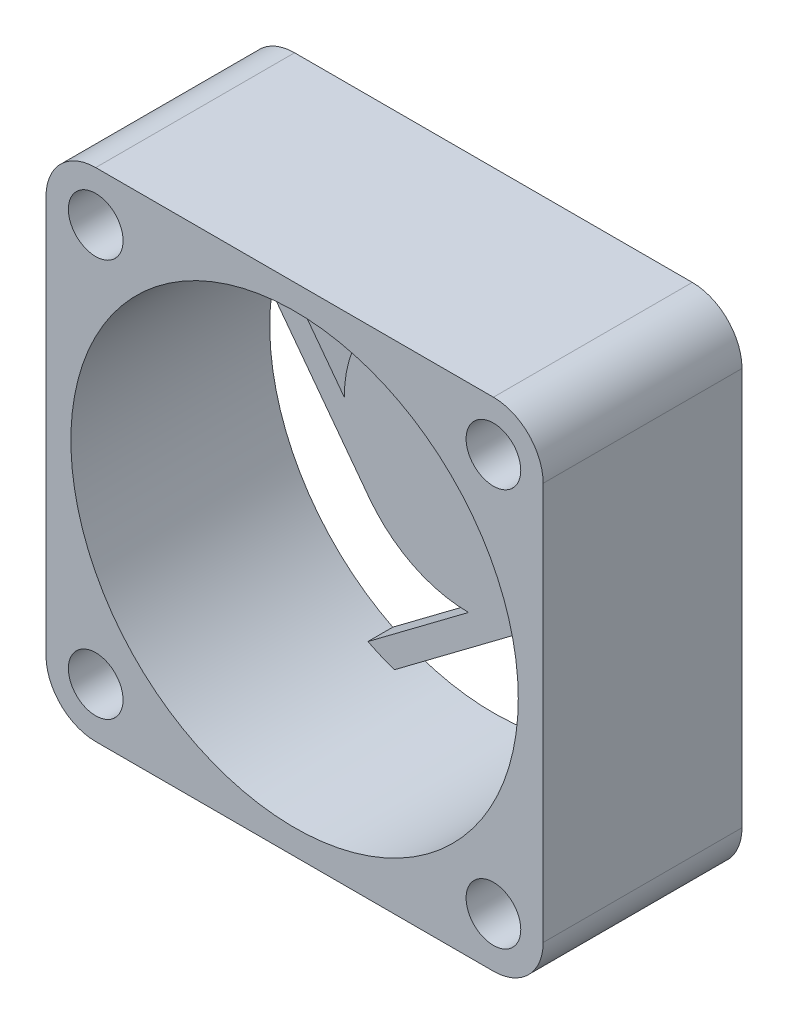
ISO-10303-21;
HEADER;
FILE_DESCRIPTION(('STEP AP214'),'2;1');
FILE_NAME('part.step','',(''),(''),'','','');
FILE_SCHEMA(('AUTOMOTIVE_DESIGN { 1 0 10303 214 1 1 1 1 }'));
ENDSEC;
DATA;
#1=APPLICATION_CONTEXT('core data for automotive mechanical design processes');
#2=APPLICATION_PROTOCOL_DEFINITION('international standard','automotive_design',2000,#1);
#3=PRODUCT_CONTEXT('',#1,'mechanical');
#4=PRODUCT('Part','Part','',(#3));
#5=PRODUCT_RELATED_PRODUCT_CATEGORY('part','',(#4));
#6=PRODUCT_DEFINITION_FORMATION('','',#4);
#7=PRODUCT_DEFINITION_CONTEXT('part definition',#1,'design');
#8=PRODUCT_DEFINITION('design','',#6,#7);
#9=PRODUCT_DEFINITION_SHAPE('','',#8);
#10=(LENGTH_UNIT() NAMED_UNIT(*) SI_UNIT(.MILLI.,.METRE.));
#11=(NAMED_UNIT(*) PLANE_ANGLE_UNIT() SI_UNIT($,.RADIAN.));
#12=(NAMED_UNIT(*) SI_UNIT($,.STERADIAN.) SOLID_ANGLE_UNIT());
#13=UNCERTAINTY_MEASURE_WITH_UNIT(LENGTH_MEASURE(1.E-05),#10,'distance_accuracy_value','');
#14=(GEOMETRIC_REPRESENTATION_CONTEXT(3) GLOBAL_UNCERTAINTY_ASSIGNED_CONTEXT((#13)) GLOBAL_UNIT_ASSIGNED_CONTEXT((#10,
#11,#12)) REPRESENTATION_CONTEXT('',''));
#15=CARTESIAN_POINT('',(0.,0.,0.));
#16=DIRECTION('',(0.,0.,1.));
#17=DIRECTION('',(1.,0.,0.));
#18=AXIS2_PLACEMENT_3D('',#15,#16,#17);
#19=CARTESIAN_POINT('',(0.,0.,8.));
#20=DIRECTION('',(0.,0.,-1.));
#21=DIRECTION('',(-1.,0.,0.));
#22=AXIS2_PLACEMENT_3D('',#19,#20,#21);
#23=PLANE('',#22);
#24=CARTESIAN_POINT('',(0.,0.,8.));
#25=DIRECTION('',(0.,0.,1.));
#26=DIRECTION('',(1.,0.,0.));
#27=AXIS2_PLACEMENT_3D('',#24,#25,#26);
#28=CIRCLE('',#27,9.);
#29=CARTESIAN_POINT('',(9.,0.,8.));
#30=VERTEX_POINT('',#29);
#31=EDGE_CURVE('E324',#30,#30,#28,.T.);
#32=ORIENTED_EDGE('',*,*,#31,.F.);
#33=EDGE_LOOP('',(#32));
#34=FACE_BOUND('',#33,.T.);
#35=DIRECTION('',(1.,0.,0.));
#36=VECTOR('',#35,1.);
#37=CARTESIAN_POINT('',(-10.,-10.,8.));
#38=LINE('',#37,#36);
#39=CARTESIAN_POINT('',(-8.,-10.,8.));
#40=VERTEX_POINT('',#39);
#41=CARTESIAN_POINT('',(8.00000000000001,-10.,8.));
#42=VERTEX_POINT('',#41);
#43=EDGE_CURVE('E364',#40,#42,#38,.T.);
#44=ORIENTED_EDGE('',*,*,#43,.T.);
#45=CARTESIAN_POINT('',(8.,-8.,8.));
#46=DIRECTION('',(0.,0.,-1.));
#47=DIRECTION('',(-1.,0.,0.));
#48=AXIS2_PLACEMENT_3D('',#45,#46,#47);
#49=CIRCLE('',#48,2.);
#50=CARTESIAN_POINT('',(10.,-8.,8.));
#51=VERTEX_POINT('',#50);
#52=EDGE_CURVE('E399',#42,#51,#49,.F.);
#53=ORIENTED_EDGE('',*,*,#52,.T.);
#54=DIRECTION('',(0.,1.,0.));
#55=VECTOR('',#54,1.);
#56=CARTESIAN_POINT('',(10.,-10.,8.));
#57=LINE('',#56,#55);
#58=CARTESIAN_POINT('',(10.,8.,8.));
#59=VERTEX_POINT('',#58);
#60=EDGE_CURVE('E356',#51,#59,#57,.T.);
#61=ORIENTED_EDGE('',*,*,#60,.T.);
#62=CARTESIAN_POINT('',(8.00000000000001,8.,8.));
#63=DIRECTION('',(0.,0.,-1.));
#64=DIRECTION('',(-1.,0.,0.));
#65=AXIS2_PLACEMENT_3D('',#62,#63,#64);
#66=CIRCLE('',#65,2.);
#67=CARTESIAN_POINT('',(8.00000000000001,10.,8.));
#68=VERTEX_POINT('',#67);
#69=EDGE_CURVE('E394',#59,#68,#66,.F.);
#70=ORIENTED_EDGE('',*,*,#69,.T.);
#71=DIRECTION('',(-1.,0.,0.));
#72=VECTOR('',#71,1.);
#73=CARTESIAN_POINT('',(-10.,10.,8.));
#74=LINE('',#73,#72);
#75=CARTESIAN_POINT('',(-8.,10.,8.));
#76=VERTEX_POINT('',#75);
#77=EDGE_CURVE('E359',#68,#76,#74,.T.);
#78=ORIENTED_EDGE('',*,*,#77,.T.);
#79=CARTESIAN_POINT('',(-8.,8.,8.));
#80=DIRECTION('',(0.,0.,-1.));
#81=DIRECTION('',(-1.,0.,0.));
#82=AXIS2_PLACEMENT_3D('',#79,#80,#81);
#83=CIRCLE('',#82,2.);
#84=CARTESIAN_POINT('',(-10.,8.,8.));
#85=VERTEX_POINT('',#84);
#86=EDGE_CURVE('E60',#76,#85,#83,.F.);
#87=ORIENTED_EDGE('',*,*,#86,.T.);
#88=DIRECTION('',(0.,-1.,0.));
#89=VECTOR('',#88,1.);
#90=CARTESIAN_POINT('',(-10.,-10.,8.));
#91=LINE('',#90,#89);
#92=CARTESIAN_POINT('',(-10.,-8.,8.));
#93=VERTEX_POINT('',#92);
#94=EDGE_CURVE('E362',#85,#93,#91,.T.);
#95=ORIENTED_EDGE('',*,*,#94,.T.);
#96=CARTESIAN_POINT('',(-8.,-8.,8.));
#97=DIRECTION('',(0.,0.,-1.));
#98=DIRECTION('',(-1.,0.,0.));
#99=AXIS2_PLACEMENT_3D('',#96,#97,#98);
#100=CIRCLE('',#99,2.);
#101=EDGE_CURVE('E397',#93,#40,#100,.F.);
#102=ORIENTED_EDGE('',*,*,#101,.T.);
#103=EDGE_LOOP('',(#44,#53,#61,#70,#78,#87,#95,#102));
#104=FACE_BOUND('',#103,.T.);
#105=CARTESIAN_POINT('',(-8.,8.,8.));
#106=DIRECTION('',(0.,0.,1.));
#107=DIRECTION('',(1.,0.,0.));
#108=AXIS2_PLACEMENT_3D('',#105,#106,#107);
#109=CIRCLE('',#108,1.1);
#110=CARTESIAN_POINT('',(-6.9,8.,8.));
#111=VERTEX_POINT('',#110);
#112=EDGE_CURVE('E350',#111,#111,#109,.T.);
#113=ORIENTED_EDGE('',*,*,#112,.F.);
#114=EDGE_LOOP('',(#113));
#115=FACE_BOUND('',#114,.T.);
#116=CARTESIAN_POINT('',(-8.,-8.,8.));
#117=DIRECTION('',(0.,0.,1.));
#118=DIRECTION('',(1.,0.,0.));
#119=AXIS2_PLACEMENT_3D('',#116,#117,#118);
#120=CIRCLE('',#119,1.1);
#121=CARTESIAN_POINT('',(-6.9,-8.,8.));
#122=VERTEX_POINT('',#121);
#123=EDGE_CURVE('E344',#122,#122,#120,.T.);
#124=ORIENTED_EDGE('',*,*,#123,.F.);
#125=EDGE_LOOP('',(#124));
#126=FACE_BOUND('',#125,.T.);
#127=CARTESIAN_POINT('',(8.00000000000001,-8.,8.));
#128=DIRECTION('',(0.,0.,1.));
#129=DIRECTION('',(1.,0.,0.));
#130=AXIS2_PLACEMENT_3D('',#127,#128,#129);
#131=CIRCLE('',#130,1.1);
#132=CARTESIAN_POINT('',(9.1,-8.,8.));
#133=VERTEX_POINT('',#132);
#134=EDGE_CURVE('E338',#133,#133,#131,.T.);
#135=ORIENTED_EDGE('',*,*,#134,.F.);
#136=EDGE_LOOP('',(#135));
#137=FACE_BOUND('',#136,.T.);
#138=CARTESIAN_POINT('',(8.,8.,8.));
#139=DIRECTION('',(0.,0.,1.));
#140=DIRECTION('',(1.,0.,0.));
#141=AXIS2_PLACEMENT_3D('',#138,#139,#140);
#142=CIRCLE('',#141,1.1);
#143=CARTESIAN_POINT('',(9.10000000000001,8.,8.));
#144=VERTEX_POINT('',#143);
#145=EDGE_CURVE('E332',#144,#144,#142,.T.);
#146=ORIENTED_EDGE('',*,*,#145,.F.);
#147=EDGE_LOOP('',(#146));
#148=FACE_BOUND('',#147,.T.);
#149=ADVANCED_FACE('F38',(#34,#104,#115,#126,#137,#148),#23,.F.);
#150=CARTESIAN_POINT('',(0.,0.,0.));
#151=DIRECTION('',(0.,0.,-1.));
#152=DIRECTION('',(-1.,0.,0.));
#153=AXIS2_PLACEMENT_3D('',#150,#151,#152);
#154=PLANE('',#153);
#155=CARTESIAN_POINT('',(0.,0.,0.));
#156=DIRECTION('',(0.,0.,-1.));
#157=DIRECTION('',(-1.,0.,0.));
#158=AXIS2_PLACEMENT_3D('',#155,#156,#157);
#159=CIRCLE('',#158,5.);
#160=CARTESIAN_POINT('',(-5.,0.,0.));
#161=VERTEX_POINT('',#160);
#162=CARTESIAN_POINT('',(-3.,4.,0.));
#163=VERTEX_POINT('',#162);
#164=EDGE_CURVE('E257',#161,#163,#159,.T.);
#165=ORIENTED_EDGE('',*,*,#164,.T.);
#166=DIRECTION('',(0.8,0.6,0.));
#167=VECTOR('',#166,1.);
#168=CARTESIAN_POINT('',(-3.,4.,0.));
#169=LINE('',#168,#167);
#170=CARTESIAN_POINT('',(2.98665181883831,8.48998886412873,0.));
#171=VERTEX_POINT('',#170);
#172=EDGE_CURVE('E237',#163,#171,#169,.T.);
#173=ORIENTED_EDGE('',*,*,#172,.T.);
#174=CARTESIAN_POINT('',(0.,0.,0.));
#175=DIRECTION('',(0.,0.,-1.));
#176=DIRECTION('',(-1.,0.,0.));
#177=AXIS2_PLACEMENT_3D('',#174,#175,#176);
#178=CIRCLE('',#177,9.);
#179=CARTESIAN_POINT('',(-8.03735464897913,4.04980619863884,0.));
#180=VERTEX_POINT('',#179);
#181=EDGE_CURVE('E263',#171,#180,#178,.F.);
#182=ORIENTED_EDGE('',*,*,#181,.T.);
#183=DIRECTION('',(0.6,-0.8,0.));
#184=VECTOR('',#183,1.);
#185=CARTESIAN_POINT('',(-5.,0.,0.));
#186=LINE('',#185,#184);
#187=EDGE_CURVE('E260',#180,#161,#186,.T.);
#188=ORIENTED_EDGE('',*,*,#187,.T.);
#189=EDGE_LOOP('',(#165,#173,#182,#188));
#190=FACE_BOUND('',#189,.T.);
#191=CARTESIAN_POINT('',(0.,0.,0.));
#192=DIRECTION('',(0.,0.,-1.));
#193=DIRECTION('',(-1.,0.,0.));
#194=AXIS2_PLACEMENT_3D('',#191,#192,#193);
#195=CIRCLE('',#194,5.);
#196=CARTESIAN_POINT('',(0.,-5.,0.));
#197=VERTEX_POINT('',#196);
#198=CARTESIAN_POINT('',(-4.,-3.,0.));
#199=VERTEX_POINT('',#198);
#200=EDGE_CURVE('E286',#197,#199,#195,.T.);
#201=ORIENTED_EDGE('',*,*,#200,.T.);
#202=DIRECTION('',(-0.6,0.8,0.));
#203=VECTOR('',#202,1.);
#204=CARTESIAN_POINT('',(-4.,-3.,0.));
#205=LINE('',#204,#203);
#206=CARTESIAN_POINT('',(-8.48998886412873,2.98665181883831,0.));
#207=VERTEX_POINT('',#206);
#208=EDGE_CURVE('E266',#199,#207,#205,.T.);
#209=ORIENTED_EDGE('',*,*,#208,.T.);
#210=CARTESIAN_POINT('',(0.,0.,0.));
#211=DIRECTION('',(0.,0.,-1.));
#212=DIRECTION('',(-1.,0.,0.));
#213=AXIS2_PLACEMENT_3D('',#210,#211,#212);
#214=CIRCLE('',#213,9.);
#215=CARTESIAN_POINT('',(-4.04980619863884,-8.03735464897913,0.));
#216=VERTEX_POINT('',#215);
#217=EDGE_CURVE('E292',#207,#216,#214,.F.);
#218=ORIENTED_EDGE('',*,*,#217,.T.);
#219=DIRECTION('',(0.8,0.6,0.));
#220=VECTOR('',#219,1.);
#221=CARTESIAN_POINT('',(0.,-5.,0.));
#222=LINE('',#221,#220);
#223=EDGE_CURVE('E289',#216,#197,#222,.T.);
#224=ORIENTED_EDGE('',*,*,#223,.T.);
#225=EDGE_LOOP('',(#201,#209,#218,#224));
#226=FACE_BOUND('',#225,.T.);
#227=CARTESIAN_POINT('',(0.,0.,0.));
#228=DIRECTION('',(0.,0.,-1.));
#229=DIRECTION('',(-1.,0.,0.));
#230=AXIS2_PLACEMENT_3D('',#227,#228,#229);
#231=CIRCLE('',#230,5.);
#232=CARTESIAN_POINT('',(0.,5.,0.));
#233=VERTEX_POINT('',#232);
#234=CARTESIAN_POINT('',(4.,3.,0.));
#235=VERTEX_POINT('',#234);
#236=EDGE_CURVE('E208',#233,#235,#231,.T.);
#237=ORIENTED_EDGE('',*,*,#236,.T.);
#238=DIRECTION('',(0.6,-0.8,0.));
#239=VECTOR('',#238,1.);
#240=CARTESIAN_POINT('',(4.,3.,0.));
#241=LINE('',#240,#239);
#242=CARTESIAN_POINT('',(8.48998886412873,-2.98665181883831,0.));
#243=VERTEX_POINT('',#242);
#244=EDGE_CURVE('E212',#235,#243,#241,.T.);
#245=ORIENTED_EDGE('',*,*,#244,.T.);
#246=CARTESIAN_POINT('',(0.,0.,0.));
#247=DIRECTION('',(0.,0.,-1.));
#248=DIRECTION('',(-1.,0.,0.));
#249=AXIS2_PLACEMENT_3D('',#246,#247,#248);
#250=CIRCLE('',#249,9.);
#251=CARTESIAN_POINT('',(4.04980619863884,8.03735464897913,0.));
#252=VERTEX_POINT('',#251);
#253=EDGE_CURVE('E234',#243,#252,#250,.F.);
#254=ORIENTED_EDGE('',*,*,#253,.T.);
#255=DIRECTION('',(-0.8,-0.6,0.));
#256=VECTOR('',#255,1.);
#257=CARTESIAN_POINT('',(0.,5.,0.));
#258=LINE('',#257,#256);
#259=EDGE_CURVE('E229',#252,#233,#258,.T.);
#260=ORIENTED_EDGE('',*,*,#259,.T.);
#261=EDGE_LOOP('',(#237,#245,#254,#260));
#262=FACE_BOUND('',#261,.T.);
#263=CARTESIAN_POINT('',(0.,0.,0.));
#264=DIRECTION('',(0.,0.,-1.));
#265=DIRECTION('',(-1.,0.,0.));
#266=AXIS2_PLACEMENT_3D('',#263,#264,#265);
#267=CIRCLE('',#266,5.);
#268=CARTESIAN_POINT('',(5.,0.,0.));
#269=VERTEX_POINT('',#268);
#270=CARTESIAN_POINT('',(3.,-4.,0.));
#271=VERTEX_POINT('',#270);
#272=EDGE_CURVE('E301',#269,#271,#267,.T.);
#273=ORIENTED_EDGE('',*,*,#272,.T.);
#274=DIRECTION('',(-0.8,-0.6,0.));
#275=VECTOR('',#274,1.);
#276=CARTESIAN_POINT('',(3.,-4.,0.));
#277=LINE('',#276,#275);
#278=CARTESIAN_POINT('',(-2.98665181883831,-8.48998886412873,0.));
#279=VERTEX_POINT('',#278);
#280=EDGE_CURVE('E316',#271,#279,#277,.T.);
#281=ORIENTED_EDGE('',*,*,#280,.T.);
#282=CARTESIAN_POINT('',(0.,0.,0.));
#283=DIRECTION('',(0.,0.,-1.));
#284=DIRECTION('',(-1.,0.,0.));
#285=AXIS2_PLACEMENT_3D('',#282,#283,#284);
#286=CIRCLE('',#285,9.);
#287=CARTESIAN_POINT('',(8.03735464897913,-4.04980619863884,0.));
#288=VERTEX_POINT('',#287);
#289=EDGE_CURVE('E295',#279,#288,#286,.F.);
#290=ORIENTED_EDGE('',*,*,#289,.T.);
#291=DIRECTION('',(-0.6,0.8,0.));
#292=VECTOR('',#291,1.);
#293=CARTESIAN_POINT('',(5.,0.,0.));
#294=LINE('',#293,#292);
#295=EDGE_CURVE('E298',#288,#269,#294,.T.);
#296=ORIENTED_EDGE('',*,*,#295,.T.);
#297=EDGE_LOOP('',(#273,#281,#290,#296));
#298=FACE_BOUND('',#297,.T.);
#299=CARTESIAN_POINT('',(8.00000000000001,-8.,0.));
#300=DIRECTION('',(0.,0.,1.));
#301=DIRECTION('',(1.,0.,0.));
#302=AXIS2_PLACEMENT_3D('',#299,#300,#301);
#303=CIRCLE('',#302,1.1);
#304=CARTESIAN_POINT('',(9.1,-8.,0.));
#305=VERTEX_POINT('',#304);
#306=EDGE_CURVE('E335',#305,#305,#303,.T.);
#307=ORIENTED_EDGE('',*,*,#306,.T.);
#308=EDGE_LOOP('',(#307));
#309=FACE_BOUND('',#308,.T.);
#310=CARTESIAN_POINT('',(-8.,8.,0.));
#311=DIRECTION('',(0.,0.,1.));
#312=DIRECTION('',(1.,0.,0.));
#313=AXIS2_PLACEMENT_3D('',#310,#311,#312);
#314=CIRCLE('',#313,1.1);
#315=CARTESIAN_POINT('',(-6.9,8.,0.));
#316=VERTEX_POINT('',#315);
#317=EDGE_CURVE('E347',#316,#316,#314,.T.);
#318=ORIENTED_EDGE('',*,*,#317,.T.);
#319=EDGE_LOOP('',(#318));
#320=FACE_BOUND('',#319,.T.);
#321=DIRECTION('',(0.,1.,0.));
#322=VECTOR('',#321,1.);
#323=CARTESIAN_POINT('',(10.,-10.,0.));
#324=LINE('',#323,#322);
#325=CARTESIAN_POINT('',(10.,-8.,0.));
#326=VERTEX_POINT('',#325);
#327=CARTESIAN_POINT('',(10.,8.,0.));
#328=VERTEX_POINT('',#327);
#329=EDGE_CURVE('E353',#326,#328,#324,.T.);
#330=ORIENTED_EDGE('',*,*,#329,.F.);
#331=CARTESIAN_POINT('',(8.,-8.,0.));
#332=DIRECTION('',(0.,0.,-1.));
#333=DIRECTION('',(-1.,0.,0.));
#334=AXIS2_PLACEMENT_3D('',#331,#332,#333);
#335=CIRCLE('',#334,2.);
#336=CARTESIAN_POINT('',(8.00000000000001,-10.,0.));
#337=VERTEX_POINT('',#336);
#338=EDGE_CURVE('E387',#326,#337,#335,.T.);
#339=ORIENTED_EDGE('',*,*,#338,.T.);
#340=DIRECTION('',(1.,0.,0.));
#341=VECTOR('',#340,1.);
#342=CARTESIAN_POINT('',(-10.,-10.,0.));
#343=LINE('',#342,#341);
#344=CARTESIAN_POINT('',(-8.,-10.,0.));
#345=VERTEX_POINT('',#344);
#346=EDGE_CURVE('E360',#345,#337,#343,.T.);
#347=ORIENTED_EDGE('',*,*,#346,.F.);
#348=CARTESIAN_POINT('',(-8.,-8.,0.));
#349=DIRECTION('',(0.,0.,-1.));
#350=DIRECTION('',(-1.,0.,0.));
#351=AXIS2_PLACEMENT_3D('',#348,#349,#350);
#352=CIRCLE('',#351,2.);
#353=CARTESIAN_POINT('',(-10.,-8.,0.));
#354=VERTEX_POINT('',#353);
#355=EDGE_CURVE('E385',#345,#354,#352,.T.);
#356=ORIENTED_EDGE('',*,*,#355,.T.);
#357=DIRECTION('',(0.,-1.,0.));
#358=VECTOR('',#357,1.);
#359=CARTESIAN_POINT('',(-10.,-10.,0.));
#360=LINE('',#359,#358);
#361=CARTESIAN_POINT('',(-10.,8.,0.));
#362=VERTEX_POINT('',#361);
#363=EDGE_CURVE('E373',#362,#354,#360,.T.);
#364=ORIENTED_EDGE('',*,*,#363,.F.);
#365=CARTESIAN_POINT('',(-8.,8.,0.));
#366=DIRECTION('',(0.,0.,-1.));
#367=DIRECTION('',(-1.,0.,0.));
#368=AXIS2_PLACEMENT_3D('',#365,#366,#367);
#369=CIRCLE('',#368,2.);
#370=CARTESIAN_POINT('',(-8.,10.,0.));
#371=VERTEX_POINT('',#370);
#372=EDGE_CURVE('E383',#362,#371,#369,.T.);
#373=ORIENTED_EDGE('',*,*,#372,.T.);
#374=DIRECTION('',(-1.,0.,0.));
#375=VECTOR('',#374,1.);
#376=CARTESIAN_POINT('',(-10.,10.,0.));
#377=LINE('',#376,#375);
#378=CARTESIAN_POINT('',(8.00000000000001,10.,0.));
#379=VERTEX_POINT('',#378);
#380=EDGE_CURVE('E370',#379,#371,#377,.T.);
#381=ORIENTED_EDGE('',*,*,#380,.F.);
#382=CARTESIAN_POINT('',(8.00000000000001,8.,0.));
#383=DIRECTION('',(0.,0.,-1.));
#384=DIRECTION('',(-1.,0.,0.));
#385=AXIS2_PLACEMENT_3D('',#382,#383,#384);
#386=CIRCLE('',#385,2.);
#387=EDGE_CURVE('E381',#379,#328,#386,.T.);
#388=ORIENTED_EDGE('',*,*,#387,.T.);
#389=EDGE_LOOP('',(#330,#339,#347,#356,#364,#373,#381,#388));
#390=FACE_BOUND('',#389,.T.);
#391=CARTESIAN_POINT('',(-8.,-8.,0.));
#392=DIRECTION('',(0.,0.,1.));
#393=DIRECTION('',(1.,0.,0.));
#394=AXIS2_PLACEMENT_3D('',#391,#392,#393);
#395=CIRCLE('',#394,1.1);
#396=CARTESIAN_POINT('',(-6.9,-8.,0.));
#397=VERTEX_POINT('',#396);
#398=EDGE_CURVE('E341',#397,#397,#395,.T.);
#399=ORIENTED_EDGE('',*,*,#398,.T.);
#400=EDGE_LOOP('',(#399));
#401=FACE_BOUND('',#400,.T.);
#402=CARTESIAN_POINT('',(8.,8.,0.));
#403=DIRECTION('',(0.,0.,1.));
#404=DIRECTION('',(1.,0.,0.));
#405=AXIS2_PLACEMENT_3D('',#402,#403,#404);
#406=CIRCLE('',#405,1.1);
#407=CARTESIAN_POINT('',(9.10000000000001,8.,0.));
#408=VERTEX_POINT('',#407);
#409=EDGE_CURVE('E327',#408,#408,#406,.T.);
#410=ORIENTED_EDGE('',*,*,#409,.T.);
#411=EDGE_LOOP('',(#410));
#412=FACE_BOUND('',#411,.T.);
#413=ADVANCED_FACE('F415',(#190,#226,#262,#298,#309,#320,#390,#401,#412),#154,.T.);
#414=CARTESIAN_POINT('',(10.,-10.,8.));
#415=DIRECTION('',(-1.,0.,0.));
#416=DIRECTION('',(0.,0.,1.));
#417=AXIS2_PLACEMENT_3D('',#414,#415,#416);
#418=PLANE('',#417);
#419=ORIENTED_EDGE('',*,*,#60,.F.);
#420=DIRECTION('',(0.,0.,-1.));
#421=VECTOR('',#420,1.);
#422=CARTESIAN_POINT('',(10.,-8.,8.));
#423=LINE('',#422,#421);
#424=EDGE_CURVE('E378',#51,#326,#423,.T.);
#425=ORIENTED_EDGE('',*,*,#424,.T.);
#426=ORIENTED_EDGE('',*,*,#329,.T.);
#427=DIRECTION('',(0.,0.,-1.));
#428=VECTOR('',#427,1.);
#429=CARTESIAN_POINT('',(10.,8.,8.));
#430=LINE('',#429,#428);
#431=EDGE_CURVE('E367',#328,#59,#430,.F.);
#432=ORIENTED_EDGE('',*,*,#431,.T.);
#433=EDGE_LOOP('',(#419,#425,#426,#432));
#434=FACE_BOUND('',#433,.T.);
#435=ADVANCED_FACE('F438',(#434),#418,.F.);
#436=CARTESIAN_POINT('',(-10.,10.,8.));
#437=DIRECTION('',(0.,-1.,0.));
#438=DIRECTION('',(0.,0.,-1.));
#439=AXIS2_PLACEMENT_3D('',#436,#437,#438);
#440=PLANE('',#439);
#441=ORIENTED_EDGE('',*,*,#380,.T.);
#442=DIRECTION('',(0.,0.,-1.));
#443=VECTOR('',#442,1.);
#444=CARTESIAN_POINT('',(-8.,10.,8.));
#445=LINE('',#444,#443);
#446=EDGE_CURVE('E11',#371,#76,#445,.F.);
#447=ORIENTED_EDGE('',*,*,#446,.T.);
#448=ORIENTED_EDGE('',*,*,#77,.F.);
#449=DIRECTION('',(0.,0.,-1.));
#450=VECTOR('',#449,1.);
#451=CARTESIAN_POINT('',(8.00000000000001,10.,8.));
#452=LINE('',#451,#450);
#453=EDGE_CURVE('E46',#68,#379,#452,.T.);
#454=ORIENTED_EDGE('',*,*,#453,.T.);
#455=EDGE_LOOP('',(#441,#447,#448,#454));
#456=FACE_BOUND('',#455,.T.);
#457=ADVANCED_FACE('F409',(#456),#440,.F.);
#458=CARTESIAN_POINT('',(-10.,-10.,8.));
#459=DIRECTION('',(1.,0.,0.));
#460=DIRECTION('',(0.,0.,-1.));
#461=AXIS2_PLACEMENT_3D('',#458,#459,#460);
#462=PLANE('',#461);
#463=ORIENTED_EDGE('',*,*,#363,.T.);
#464=DIRECTION('',(0.,0.,-1.));
#465=VECTOR('',#464,1.);
#466=CARTESIAN_POINT('',(-10.,-8.,8.));
#467=LINE('',#466,#465);
#468=EDGE_CURVE('E53',#354,#93,#467,.F.);
#469=ORIENTED_EDGE('',*,*,#468,.T.);
#470=ORIENTED_EDGE('',*,*,#94,.F.);
#471=DIRECTION('',(0.,0.,-1.));
#472=VECTOR('',#471,1.);
#473=CARTESIAN_POINT('',(-10.,8.,8.));
#474=LINE('',#473,#472);
#475=EDGE_CURVE('E401',#85,#362,#474,.T.);
#476=ORIENTED_EDGE('',*,*,#475,.T.);
#477=EDGE_LOOP('',(#463,#469,#470,#476));
#478=FACE_BOUND('',#477,.T.);
#479=ADVANCED_FACE('F421',(#478),#462,.F.);
#480=CARTESIAN_POINT('',(-10.,-10.,8.));
#481=DIRECTION('',(0.,1.,0.));
#482=DIRECTION('',(0.,0.,1.));
#483=AXIS2_PLACEMENT_3D('',#480,#481,#482);
#484=PLANE('',#483);
#485=ORIENTED_EDGE('',*,*,#346,.T.);
#486=DIRECTION('',(0.,0.,-1.));
#487=VECTOR('',#486,1.);
#488=CARTESIAN_POINT('',(8.00000000000001,-10.,8.));
#489=LINE('',#488,#487);
#490=EDGE_CURVE('E392',#337,#42,#489,.F.);
#491=ORIENTED_EDGE('',*,*,#490,.T.);
#492=ORIENTED_EDGE('',*,*,#43,.F.);
#493=DIRECTION('',(0.,0.,-1.));
#494=VECTOR('',#493,1.);
#495=CARTESIAN_POINT('',(-8.,-10.,8.));
#496=LINE('',#495,#494);
#497=EDGE_CURVE('E389',#40,#345,#496,.T.);
#498=ORIENTED_EDGE('',*,*,#497,.T.);
#499=EDGE_LOOP('',(#485,#491,#492,#498));
#500=FACE_BOUND('',#499,.T.);
#501=ADVANCED_FACE('F430',(#500),#484,.F.);
#502=CARTESIAN_POINT('',(-8.,8.,8.));
#503=DIRECTION('',(0.,0.,-1.));
#504=DIRECTION('',(-1.,0.,0.));
#505=AXIS2_PLACEMENT_3D('',#502,#503,#504);
#506=CYLINDRICAL_SURFACE('',#505,1.1);
#507=ORIENTED_EDGE('',*,*,#112,.T.);
#508=EDGE_LOOP('',(#507));
#509=FACE_BOUND('',#508,.T.);
#510=ORIENTED_EDGE('',*,*,#317,.F.);
#511=EDGE_LOOP('',(#510));
#512=FACE_BOUND('',#511,.T.);
#513=ADVANCED_FACE('F454',(#509,#512),#506,.F.);
#514=CARTESIAN_POINT('',(-8.,-8.,8.));
#515=DIRECTION('',(0.,0.,-1.));
#516=DIRECTION('',(-1.,0.,0.));
#517=AXIS2_PLACEMENT_3D('',#514,#515,#516);
#518=CYLINDRICAL_SURFACE('',#517,1.1);
#519=ORIENTED_EDGE('',*,*,#123,.T.);
#520=EDGE_LOOP('',(#519));
#521=FACE_BOUND('',#520,.T.);
#522=ORIENTED_EDGE('',*,*,#398,.F.);
#523=EDGE_LOOP('',(#522));
#524=FACE_BOUND('',#523,.T.);
#525=ADVANCED_FACE('F648',(#521,#524),#518,.F.);
#526=CARTESIAN_POINT('',(8.00000000000001,-8.,8.));
#527=DIRECTION('',(0.,0.,-1.));
#528=DIRECTION('',(-1.,0.,0.));
#529=AXIS2_PLACEMENT_3D('',#526,#527,#528);
#530=CYLINDRICAL_SURFACE('',#529,1.1);
#531=ORIENTED_EDGE('',*,*,#134,.T.);
#532=EDGE_LOOP('',(#531));
#533=FACE_BOUND('',#532,.T.);
#534=ORIENTED_EDGE('',*,*,#306,.F.);
#535=EDGE_LOOP('',(#534));
#536=FACE_BOUND('',#535,.T.);
#537=ADVANCED_FACE('F638',(#533,#536),#530,.F.);
#538=CARTESIAN_POINT('',(8.,8.,8.));
#539=DIRECTION('',(0.,0.,-1.));
#540=DIRECTION('',(-1.,0.,0.));
#541=AXIS2_PLACEMENT_3D('',#538,#539,#540);
#542=CYLINDRICAL_SURFACE('',#541,1.1);
#543=ORIENTED_EDGE('',*,*,#145,.T.);
#544=EDGE_LOOP('',(#543));
#545=FACE_BOUND('',#544,.T.);
#546=ORIENTED_EDGE('',*,*,#409,.F.);
#547=EDGE_LOOP('',(#546));
#548=FACE_BOUND('',#547,.T.);
#549=ADVANCED_FACE('F629',(#545,#548),#542,.F.);
#550=CARTESIAN_POINT('',(0.,0.,1.));
#551=DIRECTION('',(0.,0.,1.));
#552=DIRECTION('',(1.,0.,0.));
#553=AXIS2_PLACEMENT_3D('',#550,#551,#552);
#554=CYLINDRICAL_SURFACE('',#553,9.);
#555=CARTESIAN_POINT('',(0.,0.,1.));
#556=DIRECTION('',(0.,0.,1.));
#557=DIRECTION('',(1.,0.,0.));
#558=AXIS2_PLACEMENT_3D('',#555,#556,#557);
#559=CIRCLE('',#558,9.);
#560=CARTESIAN_POINT('',(4.04980619863884,8.03735464897913,1.));
#561=VERTEX_POINT('',#560);
#562=CARTESIAN_POINT('',(2.98665181883831,8.48998886412873,1.));
#563=VERTEX_POINT('',#562);
#564=EDGE_CURVE('E325',#561,#563,#559,.T.);
#565=ORIENTED_EDGE('',*,*,#564,.F.);
#566=DIRECTION('',(0.,0.,1.));
#567=VECTOR('',#566,1.);
#568=CARTESIAN_POINT('',(4.04980619863884,8.03735464897913,-0.000999999999999916));
#569=LINE('',#568,#567);
#570=EDGE_CURVE('E211',#252,#561,#569,.T.);
#571=ORIENTED_EDGE('',*,*,#570,.F.);
#572=ORIENTED_EDGE('',*,*,#253,.F.);
#573=DIRECTION('',(0.,0.,1.));
#574=VECTOR('',#573,1.);
#575=CARTESIAN_POINT('',(8.48998886412873,-2.98665181883831,-0.000999999999999916));
#576=LINE('',#575,#574);
#577=CARTESIAN_POINT('',(8.48998886412873,-2.98665181883831,1.));
#578=VERTEX_POINT('',#577);
#579=EDGE_CURVE('E803',#243,#578,#576,.T.);
#580=ORIENTED_EDGE('',*,*,#579,.T.);
#581=CARTESIAN_POINT('',(8.03735464897913,-4.04980619863884,1.));
#582=VERTEX_POINT('',#581);
#583=EDGE_CURVE('E329',#582,#578,#559,.T.);
#584=ORIENTED_EDGE('',*,*,#583,.F.);
#585=DIRECTION('',(0.,0.,1.));
#586=VECTOR('',#585,1.);
#587=CARTESIAN_POINT('',(8.03735464897913,-4.04980619863884,-0.000999999999999916));
#588=LINE('',#587,#586);
#589=EDGE_CURVE('E317',#288,#582,#588,.T.);
#590=ORIENTED_EDGE('',*,*,#589,.F.);
#591=ORIENTED_EDGE('',*,*,#289,.F.);
#592=DIRECTION('',(0.,0.,1.));
#593=VECTOR('',#592,1.);
#594=CARTESIAN_POINT('',(-2.98665181883831,-8.48998886412873,-0.000999999999999916));
#595=LINE('',#594,#593);
#596=CARTESIAN_POINT('',(-2.98665181883831,-8.48998886412873,1.));
#597=VERTEX_POINT('',#596);
#598=EDGE_CURVE('E319',#279,#597,#595,.T.);
#599=ORIENTED_EDGE('',*,*,#598,.T.);
#600=CARTESIAN_POINT('',(-4.04980619863884,-8.03735464897913,1.));
#601=VERTEX_POINT('',#600);
#602=EDGE_CURVE('E793',#601,#597,#559,.T.);
#603=ORIENTED_EDGE('',*,*,#602,.F.);
#604=DIRECTION('',(0.,0.,1.));
#605=VECTOR('',#604,1.);
#606=CARTESIAN_POINT('',(-4.04980619863884,-8.03735464897913,-0.000999999999999916));
#607=LINE('',#606,#605);
#608=EDGE_CURVE('E275',#216,#601,#607,.T.);
#609=ORIENTED_EDGE('',*,*,#608,.F.);
#610=ORIENTED_EDGE('',*,*,#217,.F.);
#611=DIRECTION('',(0.,0.,1.));
#612=VECTOR('',#611,1.);
#613=CARTESIAN_POINT('',(-8.48998886412873,2.98665181883831,-0.000999999999999916));
#614=LINE('',#613,#612);
#615=CARTESIAN_POINT('',(-8.48998886412873,2.98665181883831,1.));
#616=VERTEX_POINT('',#615);
#617=EDGE_CURVE('E273',#207,#616,#614,.T.);
#618=ORIENTED_EDGE('',*,*,#617,.T.);
#619=CARTESIAN_POINT('',(-8.03735464897913,4.04980619863884,1.));
#620=VERTEX_POINT('',#619);
#621=EDGE_CURVE('E328',#620,#616,#559,.T.);
#622=ORIENTED_EDGE('',*,*,#621,.F.);
#623=DIRECTION('',(0.,0.,1.));
#624=VECTOR('',#623,1.);
#625=CARTESIAN_POINT('',(-8.03735464897913,4.04980619863884,-0.000999999999999916));
#626=LINE('',#625,#624);
#627=EDGE_CURVE('E246',#180,#620,#626,.T.);
#628=ORIENTED_EDGE('',*,*,#627,.F.);
#629=ORIENTED_EDGE('',*,*,#181,.F.);
#630=DIRECTION('',(0.,0.,1.));
#631=VECTOR('',#630,1.);
#632=CARTESIAN_POINT('',(2.98665181883831,8.48998886412873,-0.000999999999999916));
#633=LINE('',#632,#631);
#634=EDGE_CURVE('E244',#171,#563,#633,.T.);
#635=ORIENTED_EDGE('',*,*,#634,.T.);
#636=EDGE_LOOP('',(#565,#571,#572,#580,#584,#590,#591,#599,#603,#609,#610,#618,#622,#628,#629,#635));
#637=FACE_BOUND('',#636,.T.);
#638=ORIENTED_EDGE('',*,*,#31,.T.);
#639=EDGE_LOOP('',(#638));
#640=FACE_BOUND('',#639,.T.);
#641=ADVANCED_FACE('F619',(#637,#640),#554,.F.);
#642=CARTESIAN_POINT('',(0.,0.,1.));
#643=DIRECTION('',(0.,0.,1.));
#644=DIRECTION('',(1.,0.,0.));
#645=AXIS2_PLACEMENT_3D('',#642,#643,#644);
#646=PLANE('',#645);
#647=DIRECTION('',(0.8,0.6,0.));
#648=VECTOR('',#647,1.);
#649=CARTESIAN_POINT('',(-3.,4.,1.));
#650=LINE('',#649,#648);
#651=CARTESIAN_POINT('',(-3.,4.,1.));
#652=VERTEX_POINT('',#651);
#653=EDGE_CURVE('E251',#652,#563,#650,.T.);
#654=ORIENTED_EDGE('',*,*,#653,.F.);
#655=CARTESIAN_POINT('',(0.,0.,1.));
#656=DIRECTION('',(0.,0.,-1.));
#657=DIRECTION('',(1.,0.,0.));
#658=AXIS2_PLACEMENT_3D('',#655,#656,#657);
#659=CIRCLE('',#658,5.);
#660=CARTESIAN_POINT('',(-5.,0.,1.));
#661=VERTEX_POINT('',#660);
#662=EDGE_CURVE('E254',#661,#652,#659,.T.);
#663=ORIENTED_EDGE('',*,*,#662,.F.);
#664=DIRECTION('',(0.6,-0.8,0.));
#665=VECTOR('',#664,1.);
#666=CARTESIAN_POINT('',(-5.,0.,1.));
#667=LINE('',#666,#665);
#668=EDGE_CURVE('E243',#620,#661,#667,.T.);
#669=ORIENTED_EDGE('',*,*,#668,.F.);
#670=ORIENTED_EDGE('',*,*,#621,.T.);
#671=DIRECTION('',(-0.6,0.8,0.));
#672=VECTOR('',#671,1.);
#673=CARTESIAN_POINT('',(-4.,-3.,1.));
#674=LINE('',#673,#672);
#675=CARTESIAN_POINT('',(-4.,-3.,1.));
#676=VERTEX_POINT('',#675);
#677=EDGE_CURVE('E280',#676,#616,#674,.T.);
#678=ORIENTED_EDGE('',*,*,#677,.F.);
#679=CARTESIAN_POINT('',(0.,0.,1.));
#680=DIRECTION('',(0.,0.,-1.));
#681=DIRECTION('',(1.,0.,0.));
#682=AXIS2_PLACEMENT_3D('',#679,#680,#681);
#683=CIRCLE('',#682,5.);
#684=CARTESIAN_POINT('',(0.,-5.,1.));
#685=VERTEX_POINT('',#684);
#686=EDGE_CURVE('E283',#685,#676,#683,.T.);
#687=ORIENTED_EDGE('',*,*,#686,.F.);
#688=DIRECTION('',(0.8,0.6,0.));
#689=VECTOR('',#688,1.);
#690=CARTESIAN_POINT('',(0.,-5.,1.));
#691=LINE('',#690,#689);
#692=EDGE_CURVE('E272',#601,#685,#691,.T.);
#693=ORIENTED_EDGE('',*,*,#692,.F.);
#694=ORIENTED_EDGE('',*,*,#602,.T.);
#695=DIRECTION('',(-0.8,-0.6,0.));
#696=VECTOR('',#695,1.);
#697=CARTESIAN_POINT('',(3.,-4.,1.));
#698=LINE('',#697,#696);
#699=CARTESIAN_POINT('',(3.,-4.,1.));
#700=VERTEX_POINT('',#699);
#701=EDGE_CURVE('E307',#700,#597,#698,.T.);
#702=ORIENTED_EDGE('',*,*,#701,.F.);
#703=CARTESIAN_POINT('',(0.,0.,1.));
#704=DIRECTION('',(0.,0.,-1.));
#705=DIRECTION('',(1.,0.,0.));
#706=AXIS2_PLACEMENT_3D('',#703,#704,#705);
#707=CIRCLE('',#706,5.);
#708=CARTESIAN_POINT('',(5.,0.,1.));
#709=VERTEX_POINT('',#708);
#710=EDGE_CURVE('E304',#709,#700,#707,.T.);
#711=ORIENTED_EDGE('',*,*,#710,.F.);
#712=DIRECTION('',(-0.6,0.8,0.));
#713=VECTOR('',#712,1.);
#714=CARTESIAN_POINT('',(5.,0.,1.));
#715=LINE('',#714,#713);
#716=EDGE_CURVE('E310',#582,#709,#715,.T.);
#717=ORIENTED_EDGE('',*,*,#716,.F.);
#718=ORIENTED_EDGE('',*,*,#583,.T.);
#719=DIRECTION('',(0.6,-0.8,0.));
#720=VECTOR('',#719,1.);
#721=CARTESIAN_POINT('',(4.,3.,1.));
#722=LINE('',#721,#720);
#723=CARTESIAN_POINT('',(4.,3.,1.));
#724=VERTEX_POINT('',#723);
#725=EDGE_CURVE('E221',#724,#578,#722,.T.);
#726=ORIENTED_EDGE('',*,*,#725,.F.);
#727=CARTESIAN_POINT('',(0.,0.,1.));
#728=DIRECTION('',(0.,0.,-1.));
#729=DIRECTION('',(1.,0.,0.));
#730=AXIS2_PLACEMENT_3D('',#727,#728,#729);
#731=CIRCLE('',#730,5.);
#732=CARTESIAN_POINT('',(0.,5.,1.));
#733=VERTEX_POINT('',#732);
#734=EDGE_CURVE('E205',#733,#724,#731,.T.);
#735=ORIENTED_EDGE('',*,*,#734,.F.);
#736=DIRECTION('',(-0.8,-0.6,0.));
#737=VECTOR('',#736,1.);
#738=CARTESIAN_POINT('',(0.,5.,1.));
#739=LINE('',#738,#737);
#740=EDGE_CURVE('E215',#561,#733,#739,.T.);
#741=ORIENTED_EDGE('',*,*,#740,.F.);
#742=ORIENTED_EDGE('',*,*,#564,.T.);
#743=EDGE_LOOP('',(#654,#663,#669,#670,#678,#687,#693,#694,#702,#711,#717,#718,#726,#735,#741,#742));
#744=FACE_BOUND('',#743,.T.);
#745=ADVANCED_FACE('F225',(#744),#646,.T.);
#746=CARTESIAN_POINT('',(0.,0.,-0.000999999999999916));
#747=DIRECTION('',(0.,0.,1.));
#748=DIRECTION('',(1.,0.,0.));
#749=AXIS2_PLACEMENT_3D('',#746,#747,#748);
#750=CYLINDRICAL_SURFACE('',#749,5.);
#751=DIRECTION('',(0.,0.,1.));
#752=VECTOR('',#751,1.);
#753=CARTESIAN_POINT('',(5.,0.,-0.000999999999999916));
#754=LINE('',#753,#752);
#755=EDGE_CURVE('E314',#269,#709,#754,.T.);
#756=ORIENTED_EDGE('',*,*,#755,.T.);
#757=ORIENTED_EDGE('',*,*,#710,.T.);
#758=DIRECTION('',(0.,0.,1.));
#759=VECTOR('',#758,1.);
#760=CARTESIAN_POINT('',(3.,-4.,-0.000999999999999916));
#761=LINE('',#760,#759);
#762=EDGE_CURVE('E313',#271,#700,#761,.T.);
#763=ORIENTED_EDGE('',*,*,#762,.F.);
#764=ORIENTED_EDGE('',*,*,#272,.F.);
#765=EDGE_LOOP('',(#756,#757,#763,#764));
#766=FACE_BOUND('',#765,.T.);
#767=ADVANCED_FACE('F599',(#766),#750,.T.);
#768=CARTESIAN_POINT('',(5.,0.,-0.000999999999999916));
#769=DIRECTION('',(0.8,0.6,0.));
#770=DIRECTION('',(-0.6,0.8,0.));
#771=AXIS2_PLACEMENT_3D('',#768,#769,#770);
#772=PLANE('',#771);
#773=ORIENTED_EDGE('',*,*,#589,.T.);
#774=ORIENTED_EDGE('',*,*,#716,.T.);
#775=ORIENTED_EDGE('',*,*,#755,.F.);
#776=ORIENTED_EDGE('',*,*,#295,.F.);
#777=EDGE_LOOP('',(#773,#774,#775,#776));
#778=FACE_BOUND('',#777,.T.);
#779=ADVANCED_FACE('F589',(#778),#772,.F.);
#780=CARTESIAN_POINT('',(3.,-4.,-0.000999999999999916));
#781=DIRECTION('',(-0.6,0.8,0.));
#782=DIRECTION('',(-0.8,-0.6,0.));
#783=AXIS2_PLACEMENT_3D('',#780,#781,#782);
#784=PLANE('',#783);
#785=ORIENTED_EDGE('',*,*,#762,.T.);
#786=ORIENTED_EDGE('',*,*,#701,.T.);
#787=ORIENTED_EDGE('',*,*,#598,.F.);
#788=ORIENTED_EDGE('',*,*,#280,.F.);
#789=EDGE_LOOP('',(#785,#786,#787,#788));
#790=FACE_BOUND('',#789,.T.);
#791=ADVANCED_FACE('F580',(#790),#784,.F.);
#792=CARTESIAN_POINT('',(0.,0.,-0.000999999999999916));
#793=DIRECTION('',(0.,0.,1.));
#794=DIRECTION('',(1.,0.,0.));
#795=AXIS2_PLACEMENT_3D('',#792,#793,#794);
#796=CYLINDRICAL_SURFACE('',#795,5.);
#797=DIRECTION('',(0.,0.,1.));
#798=VECTOR('',#797,1.);
#799=CARTESIAN_POINT('',(0.,5.,-0.000999999999999916));
#800=LINE('',#799,#798);
#801=EDGE_CURVE('E200',#233,#733,#800,.T.);
#802=ORIENTED_EDGE('',*,*,#801,.T.);
#803=ORIENTED_EDGE('',*,*,#734,.T.);
#804=DIRECTION('',(0.,0.,1.));
#805=VECTOR('',#804,1.);
#806=CARTESIAN_POINT('',(4.,3.,-0.000999999999999916));
#807=LINE('',#806,#805);
#808=EDGE_CURVE('E222',#235,#724,#807,.T.);
#809=ORIENTED_EDGE('',*,*,#808,.F.);
#810=ORIENTED_EDGE('',*,*,#236,.F.);
#811=EDGE_LOOP('',(#802,#803,#809,#810));
#812=FACE_BOUND('',#811,.T.);
#813=ADVANCED_FACE('F202',(#812),#796,.T.);
#814=CARTESIAN_POINT('',(0.,5.,-0.000999999999999916));
#815=DIRECTION('',(-0.6,0.8,0.));
#816=DIRECTION('',(-0.8,-0.6,0.));
#817=AXIS2_PLACEMENT_3D('',#814,#815,#816);
#818=PLANE('',#817);
#819=ORIENTED_EDGE('',*,*,#570,.T.);
#820=ORIENTED_EDGE('',*,*,#740,.T.);
#821=ORIENTED_EDGE('',*,*,#801,.F.);
#822=ORIENTED_EDGE('',*,*,#259,.F.);
#823=EDGE_LOOP('',(#819,#820,#821,#822));
#824=FACE_BOUND('',#823,.T.);
#825=ADVANCED_FACE('F216',(#824),#818,.F.);
#826=CARTESIAN_POINT('',(4.,3.,-0.000999999999999916));
#827=DIRECTION('',(-0.8,-0.6,0.));
#828=DIRECTION('',(0.6,-0.8,0.));
#829=AXIS2_PLACEMENT_3D('',#826,#827,#828);
#830=PLANE('',#829);
#831=ORIENTED_EDGE('',*,*,#808,.T.);
#832=ORIENTED_EDGE('',*,*,#725,.T.);
#833=ORIENTED_EDGE('',*,*,#579,.F.);
#834=ORIENTED_EDGE('',*,*,#244,.F.);
#835=EDGE_LOOP('',(#831,#832,#833,#834));
#836=FACE_BOUND('',#835,.T.);
#837=ADVANCED_FACE('F553',(#836),#830,.F.);
#838=CARTESIAN_POINT('',(0.,0.,-0.000999999999999916));
#839=DIRECTION('',(0.,0.,1.));
#840=DIRECTION('',(1.,0.,0.));
#841=AXIS2_PLACEMENT_3D('',#838,#839,#840);
#842=CYLINDRICAL_SURFACE('',#841,5.);
#843=DIRECTION('',(0.,0.,1.));
#844=VECTOR('',#843,1.);
#845=CARTESIAN_POINT('',(0.,-5.,-0.000999999999999916));
#846=LINE('',#845,#844);
#847=EDGE_CURVE('E269',#197,#685,#846,.T.);
#848=ORIENTED_EDGE('',*,*,#847,.T.);
#849=ORIENTED_EDGE('',*,*,#686,.T.);
#850=DIRECTION('',(0.,0.,1.));
#851=VECTOR('',#850,1.);
#852=CARTESIAN_POINT('',(-4.,-3.,-0.000999999999999916));
#853=LINE('',#852,#851);
#854=EDGE_CURVE('E270',#199,#676,#853,.T.);
#855=ORIENTED_EDGE('',*,*,#854,.F.);
#856=ORIENTED_EDGE('',*,*,#200,.F.);
#857=EDGE_LOOP('',(#848,#849,#855,#856));
#858=FACE_BOUND('',#857,.T.);
#859=ADVANCED_FACE('F543',(#858),#842,.T.);
#860=CARTESIAN_POINT('',(0.,-5.,-0.000999999999999916));
#861=DIRECTION('',(0.6,-0.8,0.));
#862=DIRECTION('',(0.8,0.6,0.));
#863=AXIS2_PLACEMENT_3D('',#860,#861,#862);
#864=PLANE('',#863);
#865=ORIENTED_EDGE('',*,*,#608,.T.);
#866=ORIENTED_EDGE('',*,*,#692,.T.);
#867=ORIENTED_EDGE('',*,*,#847,.F.);
#868=ORIENTED_EDGE('',*,*,#223,.F.);
#869=EDGE_LOOP('',(#865,#866,#867,#868));
#870=FACE_BOUND('',#869,.T.);
#871=ADVANCED_FACE('F533',(#870),#864,.F.);
#872=CARTESIAN_POINT('',(-4.,-3.,-0.000999999999999916));
#873=DIRECTION('',(0.8,0.6,0.));
#874=DIRECTION('',(-0.6,0.8,0.));
#875=AXIS2_PLACEMENT_3D('',#872,#873,#874);
#876=PLANE('',#875);
#877=ORIENTED_EDGE('',*,*,#854,.T.);
#878=ORIENTED_EDGE('',*,*,#677,.T.);
#879=ORIENTED_EDGE('',*,*,#617,.F.);
#880=ORIENTED_EDGE('',*,*,#208,.F.);
#881=EDGE_LOOP('',(#877,#878,#879,#880));
#882=FACE_BOUND('',#881,.T.);
#883=ADVANCED_FACE('F523',(#882),#876,.F.);
#884=CARTESIAN_POINT('',(0.,0.,-0.000999999999999916));
#885=DIRECTION('',(0.,0.,1.));
#886=DIRECTION('',(1.,0.,0.));
#887=AXIS2_PLACEMENT_3D('',#884,#885,#886);
#888=CYLINDRICAL_SURFACE('',#887,5.);
#889=DIRECTION('',(0.,0.,1.));
#890=VECTOR('',#889,1.);
#891=CARTESIAN_POINT('',(-5.,0.,-0.000999999999999916));
#892=LINE('',#891,#890);
#893=EDGE_CURVE('E240',#161,#661,#892,.T.);
#894=ORIENTED_EDGE('',*,*,#893,.T.);
#895=ORIENTED_EDGE('',*,*,#662,.T.);
#896=DIRECTION('',(0.,0.,1.));
#897=VECTOR('',#896,1.);
#898=CARTESIAN_POINT('',(-3.,4.,-0.000999999999999916));
#899=LINE('',#898,#897);
#900=EDGE_CURVE('E241',#163,#652,#899,.T.);
#901=ORIENTED_EDGE('',*,*,#900,.F.);
#902=ORIENTED_EDGE('',*,*,#164,.F.);
#903=EDGE_LOOP('',(#894,#895,#901,#902));
#904=FACE_BOUND('',#903,.T.);
#905=ADVANCED_FACE('F513',(#904),#888,.T.);
#906=CARTESIAN_POINT('',(-5.,0.,-0.000999999999999916));
#907=DIRECTION('',(-0.8,-0.6,0.));
#908=DIRECTION('',(0.6,-0.8,0.));
#909=AXIS2_PLACEMENT_3D('',#906,#907,#908);
#910=PLANE('',#909);
#911=ORIENTED_EDGE('',*,*,#627,.T.);
#912=ORIENTED_EDGE('',*,*,#668,.T.);
#913=ORIENTED_EDGE('',*,*,#893,.F.);
#914=ORIENTED_EDGE('',*,*,#187,.F.);
#915=EDGE_LOOP('',(#911,#912,#913,#914));
#916=FACE_BOUND('',#915,.T.);
#917=ADVANCED_FACE('F503',(#916),#910,.F.);
#918=CARTESIAN_POINT('',(-3.,4.,-0.000999999999999916));
#919=DIRECTION('',(0.6,-0.8,0.));
#920=DIRECTION('',(0.8,0.6,0.));
#921=AXIS2_PLACEMENT_3D('',#918,#919,#920);
#922=PLANE('',#921);
#923=ORIENTED_EDGE('',*,*,#900,.T.);
#924=ORIENTED_EDGE('',*,*,#653,.T.);
#925=ORIENTED_EDGE('',*,*,#634,.F.);
#926=ORIENTED_EDGE('',*,*,#172,.F.);
#927=EDGE_LOOP('',(#923,#924,#925,#926));
#928=FACE_BOUND('',#927,.T.);
#929=ADVANCED_FACE('F467',(#928),#922,.F.);
#930=CARTESIAN_POINT('',(8.,-8.,8.));
#931=DIRECTION('',(0.,0.,-1.));
#932=DIRECTION('',(-1.,0.,0.));
#933=AXIS2_PLACEMENT_3D('',#930,#931,#932);
#934=CYLINDRICAL_SURFACE('',#933,2.);
#935=ORIENTED_EDGE('',*,*,#52,.F.);
#936=ORIENTED_EDGE('',*,*,#490,.F.);
#937=ORIENTED_EDGE('',*,*,#338,.F.);
#938=ORIENTED_EDGE('',*,*,#424,.F.);
#939=EDGE_LOOP('',(#935,#936,#937,#938));
#940=FACE_BOUND('',#939,.T.);
#941=ADVANCED_FACE('F435',(#940),#934,.T.);
#942=CARTESIAN_POINT('',(-8.,-8.,8.));
#943=DIRECTION('',(0.,0.,-1.));
#944=DIRECTION('',(-1.,0.,0.));
#945=AXIS2_PLACEMENT_3D('',#942,#943,#944);
#946=CYLINDRICAL_SURFACE('',#945,2.);
#947=ORIENTED_EDGE('',*,*,#101,.F.);
#948=ORIENTED_EDGE('',*,*,#468,.F.);
#949=ORIENTED_EDGE('',*,*,#355,.F.);
#950=ORIENTED_EDGE('',*,*,#497,.F.);
#951=EDGE_LOOP('',(#947,#948,#949,#950));
#952=FACE_BOUND('',#951,.T.);
#953=ADVANCED_FACE('F427',(#952),#946,.T.);
#954=CARTESIAN_POINT('',(-8.,8.,8.));
#955=DIRECTION('',(0.,0.,-1.));
#956=DIRECTION('',(-1.,0.,0.));
#957=AXIS2_PLACEMENT_3D('',#954,#955,#956);
#958=CYLINDRICAL_SURFACE('',#957,2.);
#959=ORIENTED_EDGE('',*,*,#86,.F.);
#960=ORIENTED_EDGE('',*,*,#446,.F.);
#961=ORIENTED_EDGE('',*,*,#372,.F.);
#962=ORIENTED_EDGE('',*,*,#475,.F.);
#963=EDGE_LOOP('',(#959,#960,#961,#962));
#964=FACE_BOUND('',#963,.T.);
#965=ADVANCED_FACE('F420',(#964),#958,.T.);
#966=CARTESIAN_POINT('',(8.00000000000001,8.,8.));
#967=DIRECTION('',(0.,0.,-1.));
#968=DIRECTION('',(-1.,0.,0.));
#969=AXIS2_PLACEMENT_3D('',#966,#967,#968);
#970=CYLINDRICAL_SURFACE('',#969,2.);
#971=ORIENTED_EDGE('',*,*,#69,.F.);
#972=ORIENTED_EDGE('',*,*,#431,.F.);
#973=ORIENTED_EDGE('',*,*,#387,.F.);
#974=ORIENTED_EDGE('',*,*,#453,.F.);
#975=EDGE_LOOP('',(#971,#972,#973,#974));
#976=FACE_BOUND('',#975,.T.);
#977=ADVANCED_FACE('F40',(#976),#970,.T.);
#978=CLOSED_SHELL('',(#149,#413,#435,#457,#479,#501,#513,#525,#537,#549,#641,#745,#767,#779,
#791,#813,#825,#837,#859,#871,#883,#905,#917,#929,#941,#953,#965,#977));
#979=MANIFOLD_SOLID_BREP('B2',#978);
#980=ADVANCED_BREP_SHAPE_REPRESENTATION('',(#18,#979),#14);
#981=SHAPE_DEFINITION_REPRESENTATION(#9,#980);
ENDSEC;
END-ISO-10303-21;
